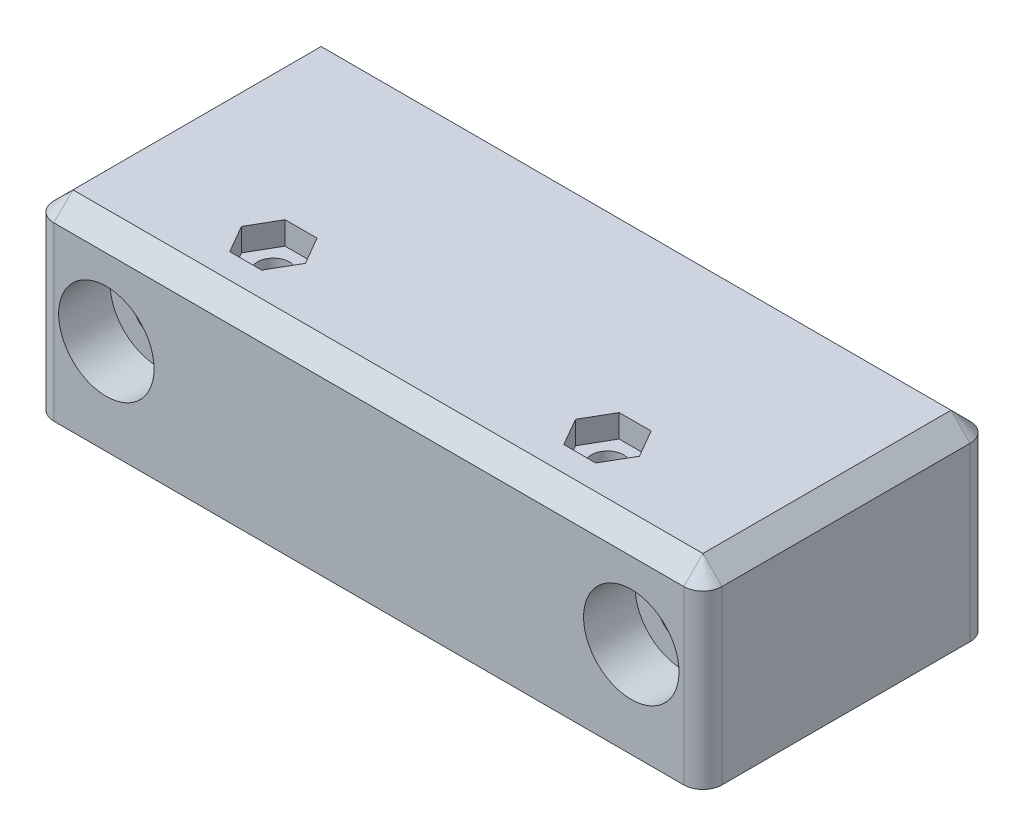
ISO-10303-21;
HEADER;
FILE_DESCRIPTION(('STEP AP214'),'2;1');
FILE_NAME('part.step','',(''),(''),'','','');
FILE_SCHEMA(('AUTOMOTIVE_DESIGN { 1 0 10303 214 1 1 1 1 }'));
ENDSEC;
DATA;
#1=APPLICATION_CONTEXT('core data for automotive mechanical design processes');
#2=APPLICATION_PROTOCOL_DEFINITION('international standard','automotive_design',2000,#1);
#3=PRODUCT_CONTEXT('',#1,'mechanical');
#4=PRODUCT('Part','Part','',(#3));
#5=PRODUCT_RELATED_PRODUCT_CATEGORY('part','',(#4));
#6=PRODUCT_DEFINITION_FORMATION('','',#4);
#7=PRODUCT_DEFINITION_CONTEXT('part definition',#1,'design');
#8=PRODUCT_DEFINITION('design','',#6,#7);
#9=PRODUCT_DEFINITION_SHAPE('','',#8);
#10=(LENGTH_UNIT() NAMED_UNIT(*) SI_UNIT(.MILLI.,.METRE.));
#11=(NAMED_UNIT(*) PLANE_ANGLE_UNIT() SI_UNIT($,.RADIAN.));
#12=(NAMED_UNIT(*) SI_UNIT($,.STERADIAN.) SOLID_ANGLE_UNIT());
#13=UNCERTAINTY_MEASURE_WITH_UNIT(LENGTH_MEASURE(1.E-05),#10,'distance_accuracy_value','');
#14=(GEOMETRIC_REPRESENTATION_CONTEXT(3) GLOBAL_UNCERTAINTY_ASSIGNED_CONTEXT((#13)) GLOBAL_UNIT_ASSIGNED_CONTEXT((#10,
#11,#12)) REPRESENTATION_CONTEXT('',''));
#15=CARTESIAN_POINT('',(0.,0.,0.));
#16=DIRECTION('',(0.,0.,1.));
#17=DIRECTION('',(1.,0.,0.));
#18=AXIS2_PLACEMENT_3D('',#15,#16,#17);
#19=CARTESIAN_POINT('',(-35.,96.1577310586391,30.));
#20=DIRECTION('',(1.,0.,0.));
#21=DIRECTION('',(0.,0.,-1.));
#22=AXIS2_PLACEMENT_3D('',#19,#20,#21);
#23=PLANE('',#22);
#24=DIRECTION('',(0.,-1.,0.));
#25=VECTOR('',#24,1.);
#26=CARTESIAN_POINT('',(-35.,96.1577310586391,28.));
#27=LINE('',#26,#25);
#28=CARTESIAN_POINT('',(-35.,0.,28.));
#29=VERTEX_POINT('',#28);
#30=CARTESIAN_POINT('',(-35.,18.,28.));
#31=VERTEX_POINT('',#30);
#32=EDGE_CURVE('E337',#29,#31,#27,.F.);
#33=ORIENTED_EDGE('',*,*,#32,.T.);
#34=DIRECTION('',(0.,0.,-1.));
#35=VECTOR('',#34,1.);
#36=CARTESIAN_POINT('',(-35.,18.,2.));
#37=LINE('',#36,#35);
#38=CARTESIAN_POINT('',(-35.,18.,2.));
#39=VERTEX_POINT('',#38);
#40=EDGE_CURVE('E351',#31,#39,#37,.T.);
#41=ORIENTED_EDGE('',*,*,#40,.T.);
#42=DIRECTION('',(0.,-1.,0.));
#43=VECTOR('',#42,1.);
#44=CARTESIAN_POINT('',(-35.,96.1577310586391,2.));
#45=LINE('',#44,#43);
#46=CARTESIAN_POINT('',(-35.,0.,2.));
#47=VERTEX_POINT('',#46);
#48=EDGE_CURVE('E340',#39,#47,#45,.T.);
#49=ORIENTED_EDGE('',*,*,#48,.T.);
#50=DIRECTION('',(0.,0.,1.));
#51=VECTOR('',#50,1.);
#52=CARTESIAN_POINT('',(-35.,0.,30.));
#53=LINE('',#52,#51);
#54=EDGE_CURVE('E246',#47,#29,#53,.T.);
#55=ORIENTED_EDGE('',*,*,#54,.T.);
#56=EDGE_LOOP('',(#33,#41,#49,#55));
#57=FACE_BOUND('',#56,.T.);
#58=ADVANCED_FACE('F40',(#57),#23,.F.);
#59=CARTESIAN_POINT('',(-35.,96.1577310586391,30.));
#60=DIRECTION('',(0.,0.,-1.));
#61=DIRECTION('',(-1.,0.,0.));
#62=AXIS2_PLACEMENT_3D('',#59,#60,#61);
#63=PLANE('',#62);
#64=CARTESIAN_POINT('',(-27.5,10.,30.));
#65=DIRECTION('',(0.,0.,1.));
#66=DIRECTION('',(1.,0.,0.));
#67=AXIS2_PLACEMENT_3D('',#64,#65,#66);
#68=CIRCLE('',#67,5.);
#69=CARTESIAN_POINT('',(-22.5,10.,30.));
#70=VERTEX_POINT('',#69);
#71=EDGE_CURVE('E387',#70,#70,#68,.T.);
#72=ORIENTED_EDGE('',*,*,#71,.F.);
#73=EDGE_LOOP('',(#72));
#74=FACE_BOUND('',#73,.T.);
#75=CARTESIAN_POINT('',(27.5,10.,30.));
#76=DIRECTION('',(0.,0.,1.));
#77=DIRECTION('',(1.,0.,0.));
#78=AXIS2_PLACEMENT_3D('',#75,#76,#77);
#79=CIRCLE('',#78,5.);
#80=CARTESIAN_POINT('',(32.5,10.,30.));
#81=VERTEX_POINT('',#80);
#82=EDGE_CURVE('E405',#81,#81,#79,.T.);
#83=ORIENTED_EDGE('',*,*,#82,.F.);
#84=EDGE_LOOP('',(#83));
#85=FACE_BOUND('',#84,.T.);
#86=DIRECTION('',(0.,-1.,0.));
#87=VECTOR('',#86,1.);
#88=CARTESIAN_POINT('',(33.,96.1577310586391,30.));
#89=LINE('',#88,#87);
#90=CARTESIAN_POINT('',(33.,0.,30.));
#91=VERTEX_POINT('',#90);
#92=CARTESIAN_POINT('',(33.,18.,30.));
#93=VERTEX_POINT('',#92);
#94=EDGE_CURVE('E329',#91,#93,#89,.F.);
#95=ORIENTED_EDGE('',*,*,#94,.T.);
#96=DIRECTION('',(-1.,0.,0.));
#97=VECTOR('',#96,1.);
#98=CARTESIAN_POINT('',(-33.,18.,30.));
#99=LINE('',#98,#97);
#100=CARTESIAN_POINT('',(-33.,18.,30.));
#101=VERTEX_POINT('',#100);
#102=EDGE_CURVE('E358',#93,#101,#99,.T.);
#103=ORIENTED_EDGE('',*,*,#102,.T.);
#104=DIRECTION('',(0.,-1.,0.));
#105=VECTOR('',#104,1.);
#106=CARTESIAN_POINT('',(-33.,96.1577310586391,30.));
#107=LINE('',#106,#105);
#108=CARTESIAN_POINT('',(-33.,0.,30.));
#109=VERTEX_POINT('',#108);
#110=EDGE_CURVE('E327',#101,#109,#107,.T.);
#111=ORIENTED_EDGE('',*,*,#110,.T.);
#112=DIRECTION('',(1.,0.,0.));
#113=VECTOR('',#112,1.);
#114=CARTESIAN_POINT('',(-35.,0.,30.));
#115=LINE('',#114,#113);
#116=EDGE_CURVE('E309',#109,#91,#115,.T.);
#117=ORIENTED_EDGE('',*,*,#116,.T.);
#118=EDGE_LOOP('',(#95,#103,#111,#117));
#119=FACE_BOUND('',#118,.T.);
#120=ADVANCED_FACE('F443',(#74,#85,#119),#63,.F.);
#121=CARTESIAN_POINT('',(35.,96.1577310586391,30.));
#122=DIRECTION('',(-1.,0.,0.));
#123=DIRECTION('',(0.,0.,1.));
#124=AXIS2_PLACEMENT_3D('',#121,#122,#123);
#125=PLANE('',#124);
#126=DIRECTION('',(0.,-1.,0.));
#127=VECTOR('',#126,1.);
#128=CARTESIAN_POINT('',(35.,96.1577310586391,2.));
#129=LINE('',#128,#127);
#130=CARTESIAN_POINT('',(35.,0.,2.));
#131=VERTEX_POINT('',#130);
#132=CARTESIAN_POINT('',(35.,18.,2.));
#133=VERTEX_POINT('',#132);
#134=EDGE_CURVE('E305',#131,#133,#129,.F.);
#135=ORIENTED_EDGE('',*,*,#134,.T.);
#136=DIRECTION('',(0.,0.,1.));
#137=VECTOR('',#136,1.);
#138=CARTESIAN_POINT('',(35.,18.,28.));
#139=LINE('',#138,#137);
#140=CARTESIAN_POINT('',(35.,18.,28.));
#141=VERTEX_POINT('',#140);
#142=EDGE_CURVE('E11',#133,#141,#139,.T.);
#143=ORIENTED_EDGE('',*,*,#142,.T.);
#144=DIRECTION('',(0.,-1.,0.));
#145=VECTOR('',#144,1.);
#146=CARTESIAN_POINT('',(35.,96.1577310586391,28.));
#147=LINE('',#146,#145);
#148=CARTESIAN_POINT('',(35.,0.,28.));
#149=VERTEX_POINT('',#148);
#150=EDGE_CURVE('E317',#141,#149,#147,.T.);
#151=ORIENTED_EDGE('',*,*,#150,.T.);
#152=DIRECTION('',(0.,0.,-1.));
#153=VECTOR('',#152,1.);
#154=CARTESIAN_POINT('',(35.,0.,30.));
#155=LINE('',#154,#153);
#156=EDGE_CURVE('E306',#149,#131,#155,.T.);
#157=ORIENTED_EDGE('',*,*,#156,.T.);
#158=EDGE_LOOP('',(#135,#143,#151,#157));
#159=FACE_BOUND('',#158,.T.);
#160=ADVANCED_FACE('F449',(#159),#125,.F.);
#161=CARTESIAN_POINT('',(-35.,96.1577310586391,0.));
#162=DIRECTION('',(0.,0.,1.));
#163=DIRECTION('',(1.,0.,0.));
#164=AXIS2_PLACEMENT_3D('',#161,#162,#163);
#165=PLANE('',#164);
#166=CARTESIAN_POINT('',(-27.5,10.,0.));
#167=DIRECTION('',(0.,0.,1.));
#168=DIRECTION('',(1.,0.,0.));
#169=AXIS2_PLACEMENT_3D('',#166,#167,#168);
#170=CIRCLE('',#169,2.74999999999999);
#171=CARTESIAN_POINT('',(-24.75,10.,0.));
#172=VERTEX_POINT('',#171);
#173=EDGE_CURVE('E402',#172,#172,#170,.T.);
#174=ORIENTED_EDGE('',*,*,#173,.T.);
#175=EDGE_LOOP('',(#174));
#176=FACE_BOUND('',#175,.T.);
#177=CARTESIAN_POINT('',(27.5,10.,0.));
#178=DIRECTION('',(0.,0.,1.));
#179=DIRECTION('',(1.,0.,0.));
#180=AXIS2_PLACEMENT_3D('',#177,#178,#179);
#181=CIRCLE('',#180,2.74999999999999);
#182=CARTESIAN_POINT('',(30.25,10.,0.));
#183=VERTEX_POINT('',#182);
#184=EDGE_CURVE('E414',#183,#183,#181,.T.);
#185=ORIENTED_EDGE('',*,*,#184,.T.);
#186=EDGE_LOOP('',(#185));
#187=FACE_BOUND('',#186,.T.);
#188=DIRECTION('',(0.,-1.,0.));
#189=VECTOR('',#188,1.);
#190=CARTESIAN_POINT('',(-33.,96.1577310586391,0.));
#191=LINE('',#190,#189);
#192=CARTESIAN_POINT('',(-33.,0.,0.));
#193=VERTEX_POINT('',#192);
#194=CARTESIAN_POINT('',(-33.,18.,0.));
#195=VERTEX_POINT('',#194);
#196=EDGE_CURVE('E332',#193,#195,#191,.F.);
#197=ORIENTED_EDGE('',*,*,#196,.T.);
#198=DIRECTION('',(1.,0.,0.));
#199=VECTOR('',#198,1.);
#200=CARTESIAN_POINT('',(33.,18.,0.));
#201=LINE('',#200,#199);
#202=CARTESIAN_POINT('',(33.,18.,0.));
#203=VERTEX_POINT('',#202);
#204=EDGE_CURVE('E360',#195,#203,#201,.T.);
#205=ORIENTED_EDGE('',*,*,#204,.T.);
#206=DIRECTION('',(0.,-1.,0.));
#207=VECTOR('',#206,1.);
#208=CARTESIAN_POINT('',(33.,96.1577310586391,0.));
#209=LINE('',#208,#207);
#210=CARTESIAN_POINT('',(33.,0.,0.));
#211=VERTEX_POINT('',#210);
#212=EDGE_CURVE('E335',#203,#211,#209,.T.);
#213=ORIENTED_EDGE('',*,*,#212,.T.);
#214=DIRECTION('',(-1.,0.,0.));
#215=VECTOR('',#214,1.);
#216=CARTESIAN_POINT('',(-35.,0.,0.));
#217=LINE('',#216,#215);
#218=EDGE_CURVE('E302',#211,#193,#217,.T.);
#219=ORIENTED_EDGE('',*,*,#218,.T.);
#220=EDGE_LOOP('',(#197,#205,#213,#219));
#221=FACE_BOUND('',#220,.T.);
#222=ADVANCED_FACE('F541',(#176,#187,#221),#165,.F.);
#223=CARTESIAN_POINT('',(0.,0.,0.));
#224=DIRECTION('',(0.,-1.,0.));
#225=DIRECTION('',(0.,0.,-1.));
#226=AXIS2_PLACEMENT_3D('',#223,#224,#225);
#227=PLANE('',#226);
#228=CARTESIAN_POINT('',(-17.5,0.,22.5));
#229=DIRECTION('',(0.,1.,0.));
#230=DIRECTION('',(0.,0.,1.));
#231=AXIS2_PLACEMENT_3D('',#228,#229,#230);
#232=CIRCLE('',#231,1.7);
#233=CARTESIAN_POINT('',(-17.5,0.,24.2));
#234=VERTEX_POINT('',#233);
#235=EDGE_CURVE('E417',#234,#234,#232,.T.);
#236=ORIENTED_EDGE('',*,*,#235,.T.);
#237=EDGE_LOOP('',(#236));
#238=FACE_BOUND('',#237,.T.);
#239=CARTESIAN_POINT('',(17.5,0.,22.5));
#240=DIRECTION('',(0.,1.,0.));
#241=DIRECTION('',(0.,0.,1.));
#242=AXIS2_PLACEMENT_3D('',#239,#240,#241);
#243=CIRCLE('',#242,1.7);
#244=CARTESIAN_POINT('',(17.5,0.,24.2));
#245=VERTEX_POINT('',#244);
#246=EDGE_CURVE('E222',#245,#245,#243,.T.);
#247=ORIENTED_EDGE('',*,*,#246,.T.);
#248=EDGE_LOOP('',(#247));
#249=FACE_BOUND('',#248,.T.);
#250=ORIENTED_EDGE('',*,*,#156,.F.);
#251=CARTESIAN_POINT('',(33.,0.,28.));
#252=DIRECTION('',(0.,-1.,0.));
#253=DIRECTION('',(0.,0.,-1.));
#254=AXIS2_PLACEMENT_3D('',#251,#252,#253);
#255=CIRCLE('',#254,2.);
#256=EDGE_CURVE('E325',#149,#91,#255,.T.);
#257=ORIENTED_EDGE('',*,*,#256,.T.);
#258=ORIENTED_EDGE('',*,*,#116,.F.);
#259=CARTESIAN_POINT('',(-33.,0.,28.));
#260=DIRECTION('',(0.,-1.,0.));
#261=DIRECTION('',(0.,0.,-1.));
#262=AXIS2_PLACEMENT_3D('',#259,#260,#261);
#263=CIRCLE('',#262,2.);
#264=EDGE_CURVE('E319',#109,#29,#263,.T.);
#265=ORIENTED_EDGE('',*,*,#264,.T.);
#266=ORIENTED_EDGE('',*,*,#54,.F.);
#267=CARTESIAN_POINT('',(-33.,0.,2.));
#268=DIRECTION('',(0.,-1.,0.));
#269=DIRECTION('',(0.,0.,-1.));
#270=AXIS2_PLACEMENT_3D('',#267,#268,#269);
#271=CIRCLE('',#270,2.);
#272=EDGE_CURVE('E321',#47,#193,#271,.T.);
#273=ORIENTED_EDGE('',*,*,#272,.T.);
#274=ORIENTED_EDGE('',*,*,#218,.F.);
#275=CARTESIAN_POINT('',(33.,0.,2.));
#276=DIRECTION('',(0.,-1.,0.));
#277=DIRECTION('',(0.,0.,-1.));
#278=AXIS2_PLACEMENT_3D('',#275,#276,#277);
#279=CIRCLE('',#278,2.);
#280=EDGE_CURVE('E323',#211,#131,#279,.T.);
#281=ORIENTED_EDGE('',*,*,#280,.T.);
#282=EDGE_LOOP('',(#250,#257,#258,#265,#266,#273,#274,#281));
#283=FACE_BOUND('',#282,.T.);
#284=ADVANCED_FACE('F426',(#238,#249,#283),#227,.T.);
#285=CARTESIAN_POINT('',(0.,20.,0.));
#286=DIRECTION('',(0.,1.,0.));
#287=DIRECTION('',(0.,0.,1.));
#288=AXIS2_PLACEMENT_3D('',#285,#286,#287);
#289=PLANE('',#288);
#290=DIRECTION('',(-1.,0.,0.));
#291=VECTOR('',#290,1.);
#292=CARTESIAN_POINT('',(-33.,20.,1.99999999999999));
#293=LINE('',#292,#291);
#294=CARTESIAN_POINT('',(33.,20.,2.));
#295=VERTEX_POINT('',#294);
#296=CARTESIAN_POINT('',(-33.,20.,1.99999999999999));
#297=VERTEX_POINT('',#296);
#298=EDGE_CURVE('E344',#295,#297,#293,.T.);
#299=ORIENTED_EDGE('',*,*,#298,.T.);
#300=DIRECTION('',(0.,0.,1.));
#301=VECTOR('',#300,1.);
#302=CARTESIAN_POINT('',(-33.,20.,28.));
#303=LINE('',#302,#301);
#304=CARTESIAN_POINT('',(-33.,20.,28.));
#305=VERTEX_POINT('',#304);
#306=EDGE_CURVE('E348',#297,#305,#303,.T.);
#307=ORIENTED_EDGE('',*,*,#306,.T.);
#308=DIRECTION('',(1.,0.,0.));
#309=VECTOR('',#308,1.);
#310=CARTESIAN_POINT('',(33.,20.,28.));
#311=LINE('',#310,#309);
#312=CARTESIAN_POINT('',(33.,20.,28.));
#313=VERTEX_POINT('',#312);
#314=EDGE_CURVE('E346',#305,#313,#311,.T.);
#315=ORIENTED_EDGE('',*,*,#314,.T.);
#316=DIRECTION('',(0.,0.,-1.));
#317=VECTOR('',#316,1.);
#318=CARTESIAN_POINT('',(33.,20.,2.));
#319=LINE('',#318,#317);
#320=EDGE_CURVE('E342',#313,#295,#319,.T.);
#321=ORIENTED_EDGE('',*,*,#320,.T.);
#322=EDGE_LOOP('',(#299,#307,#315,#321));
#323=FACE_BOUND('',#322,.T.);
#324=DIRECTION('',(-0.5,0.,-0.866025403784438));
#325=VECTOR('',#324,1.);
#326=CARTESIAN_POINT('',(-14.1513684387002,20.,22.5));
#327=LINE('',#326,#325);
#328=CARTESIAN_POINT('',(-14.1513684387002,20.,22.5));
#329=VERTEX_POINT('',#328);
#330=CARTESIAN_POINT('',(-15.8256842193501,20.,19.6));
#331=VERTEX_POINT('',#330);
#332=EDGE_CURVE('E198',#329,#331,#327,.T.);
#333=ORIENTED_EDGE('',*,*,#332,.F.);
#334=DIRECTION('',(0.5,0.,-0.866025403784438));
#335=VECTOR('',#334,1.);
#336=CARTESIAN_POINT('',(-15.8256842193501,20.,25.4));
#337=LINE('',#336,#335);
#338=CARTESIAN_POINT('',(-15.8256842193501,20.,25.4));
#339=VERTEX_POINT('',#338);
#340=EDGE_CURVE('E216',#339,#329,#337,.T.);
#341=ORIENTED_EDGE('',*,*,#340,.F.);
#342=DIRECTION('',(1.,0.,0.));
#343=VECTOR('',#342,1.);
#344=CARTESIAN_POINT('',(-19.1743157806499,20.,25.4));
#345=LINE('',#344,#343);
#346=CARTESIAN_POINT('',(-19.1743157806499,20.,25.4));
#347=VERTEX_POINT('',#346);
#348=EDGE_CURVE('E219',#347,#339,#345,.T.);
#349=ORIENTED_EDGE('',*,*,#348,.F.);
#350=DIRECTION('',(0.5,0.,0.866025403784438));
#351=VECTOR('',#350,1.);
#352=CARTESIAN_POINT('',(-20.8486315612998,20.,22.5));
#353=LINE('',#352,#351);
#354=CARTESIAN_POINT('',(-20.8486315612998,20.,22.5));
#355=VERTEX_POINT('',#354);
#356=EDGE_CURVE('E239',#355,#347,#353,.T.);
#357=ORIENTED_EDGE('',*,*,#356,.F.);
#358=DIRECTION('',(-0.499999999999999,0.,0.866025403784439));
#359=VECTOR('',#358,1.);
#360=CARTESIAN_POINT('',(-19.1743157806499,20.,19.6));
#361=LINE('',#360,#359);
#362=CARTESIAN_POINT('',(-19.1743157806499,20.,19.6));
#363=VERTEX_POINT('',#362);
#364=EDGE_CURVE('E236',#363,#355,#361,.T.);
#365=ORIENTED_EDGE('',*,*,#364,.F.);
#366=DIRECTION('',(-1.,0.,0.));
#367=VECTOR('',#366,1.);
#368=CARTESIAN_POINT('',(-15.8256842193501,20.,19.6));
#369=LINE('',#368,#367);
#370=EDGE_CURVE('E233',#331,#363,#369,.T.);
#371=ORIENTED_EDGE('',*,*,#370,.F.);
#372=EDGE_LOOP('',(#333,#341,#349,#357,#365,#371));
#373=FACE_BOUND('',#372,.T.);
#374=DIRECTION('',(-0.5,0.,-0.866025403784438));
#375=VECTOR('',#374,1.);
#376=CARTESIAN_POINT('',(20.8486315612998,20.,22.5));
#377=LINE('',#376,#375);
#378=CARTESIAN_POINT('',(20.8486315612998,20.,22.5));
#379=VERTEX_POINT('',#378);
#380=CARTESIAN_POINT('',(19.1743157806499,20.,19.6));
#381=VERTEX_POINT('',#380);
#382=EDGE_CURVE('E274',#379,#381,#377,.T.);
#383=ORIENTED_EDGE('',*,*,#382,.F.);
#384=DIRECTION('',(0.5,0.,-0.866025403784438));
#385=VECTOR('',#384,1.);
#386=CARTESIAN_POINT('',(19.1743157806499,20.,25.4));
#387=LINE('',#386,#385);
#388=CARTESIAN_POINT('',(19.1743157806499,20.,25.4));
#389=VERTEX_POINT('',#388);
#390=EDGE_CURVE('E258',#389,#379,#387,.T.);
#391=ORIENTED_EDGE('',*,*,#390,.F.);
#392=DIRECTION('',(1.,0.,0.));
#393=VECTOR('',#392,1.);
#394=CARTESIAN_POINT('',(15.8256842193501,20.,25.4));
#395=LINE('',#394,#393);
#396=CARTESIAN_POINT('',(15.8256842193501,20.,25.4));
#397=VERTEX_POINT('',#396);
#398=EDGE_CURVE('E286',#397,#389,#395,.T.);
#399=ORIENTED_EDGE('',*,*,#398,.F.);
#400=DIRECTION('',(0.5,0.,0.866025403784438));
#401=VECTOR('',#400,1.);
#402=CARTESIAN_POINT('',(14.1513684387002,20.,22.5));
#403=LINE('',#402,#401);
#404=CARTESIAN_POINT('',(14.1513684387002,20.,22.5));
#405=VERTEX_POINT('',#404);
#406=EDGE_CURVE('E283',#405,#397,#403,.T.);
#407=ORIENTED_EDGE('',*,*,#406,.F.);
#408=DIRECTION('',(-0.5,0.,0.866025403784439));
#409=VECTOR('',#408,1.);
#410=CARTESIAN_POINT('',(15.8256842193501,20.,19.6));
#411=LINE('',#410,#409);
#412=CARTESIAN_POINT('',(15.8256842193501,20.,19.6));
#413=VERTEX_POINT('',#412);
#414=EDGE_CURVE('E280',#413,#405,#411,.T.);
#415=ORIENTED_EDGE('',*,*,#414,.F.);
#416=DIRECTION('',(-1.,0.,0.));
#417=VECTOR('',#416,1.);
#418=CARTESIAN_POINT('',(19.1743157806499,20.,19.6));
#419=LINE('',#418,#417);
#420=EDGE_CURVE('E276',#381,#413,#419,.T.);
#421=ORIENTED_EDGE('',*,*,#420,.F.);
#422=EDGE_LOOP('',(#383,#391,#399,#407,#415,#421));
#423=FACE_BOUND('',#422,.T.);
#424=ADVANCED_FACE('F454',(#323,#373,#423),#289,.T.);
#425=CARTESIAN_POINT('',(20.8486315612998,17.6,22.5));
#426=DIRECTION('',(0.866025403784439,0.,-0.5));
#427=DIRECTION('',(-0.5,0.,-0.866025403784439));
#428=AXIS2_PLACEMENT_3D('',#425,#426,#427);
#429=PLANE('',#428);
#430=ORIENTED_EDGE('',*,*,#382,.T.);
#431=DIRECTION('',(0.,1.,0.));
#432=VECTOR('',#431,1.);
#433=CARTESIAN_POINT('',(19.1743157806499,17.6,19.6));
#434=LINE('',#433,#432);
#435=CARTESIAN_POINT('',(19.1743157806499,17.6,19.6));
#436=VERTEX_POINT('',#435);
#437=EDGE_CURVE('E273',#436,#381,#434,.T.);
#438=ORIENTED_EDGE('',*,*,#437,.F.);
#439=DIRECTION('',(-0.5,0.,-0.866025403784438));
#440=VECTOR('',#439,1.);
#441=CARTESIAN_POINT('',(20.8486315612998,17.6,22.5));
#442=LINE('',#441,#440);
#443=CARTESIAN_POINT('',(20.8486315612998,17.6,22.5));
#444=VERTEX_POINT('',#443);
#445=EDGE_CURVE('E254',#444,#436,#442,.T.);
#446=ORIENTED_EDGE('',*,*,#445,.F.);
#447=DIRECTION('',(0.,1.,0.));
#448=VECTOR('',#447,1.);
#449=CARTESIAN_POINT('',(20.8486315612998,17.6,22.5));
#450=LINE('',#449,#448);
#451=EDGE_CURVE('E234',#444,#379,#450,.T.);
#452=ORIENTED_EDGE('',*,*,#451,.T.);
#453=EDGE_LOOP('',(#430,#438,#446,#452));
#454=FACE_BOUND('',#453,.T.);
#455=ADVANCED_FACE('F457',(#454),#429,.F.);
#456=CARTESIAN_POINT('',(19.1743157806499,17.6,25.4));
#457=DIRECTION('',(0.866025403784439,0.,0.5));
#458=DIRECTION('',(0.5,0.,-0.866025403784439));
#459=AXIS2_PLACEMENT_3D('',#456,#457,#458);
#460=PLANE('',#459);
#461=ORIENTED_EDGE('',*,*,#390,.T.);
#462=ORIENTED_EDGE('',*,*,#451,.F.);
#463=DIRECTION('',(0.5,0.,-0.866025403784438));
#464=VECTOR('',#463,1.);
#465=CARTESIAN_POINT('',(19.1743157806499,17.6,25.4));
#466=LINE('',#465,#464);
#467=CARTESIAN_POINT('',(19.1743157806499,17.6,25.4));
#468=VERTEX_POINT('',#467);
#469=EDGE_CURVE('E270',#468,#444,#466,.T.);
#470=ORIENTED_EDGE('',*,*,#469,.F.);
#471=DIRECTION('',(0.,1.,0.));
#472=VECTOR('',#471,1.);
#473=CARTESIAN_POINT('',(19.1743157806499,17.6,25.4));
#474=LINE('',#473,#472);
#475=EDGE_CURVE('E292',#468,#389,#474,.T.);
#476=ORIENTED_EDGE('',*,*,#475,.T.);
#477=EDGE_LOOP('',(#461,#462,#470,#476));
#478=FACE_BOUND('',#477,.T.);
#479=ADVANCED_FACE('F574',(#478),#460,.F.);
#480=CARTESIAN_POINT('',(15.8256842193501,17.6,25.4));
#481=DIRECTION('',(0.,0.,1.));
#482=DIRECTION('',(1.,0.,0.));
#483=AXIS2_PLACEMENT_3D('',#480,#481,#482);
#484=PLANE('',#483);
#485=ORIENTED_EDGE('',*,*,#398,.T.);
#486=ORIENTED_EDGE('',*,*,#475,.F.);
#487=DIRECTION('',(1.,0.,0.));
#488=VECTOR('',#487,1.);
#489=CARTESIAN_POINT('',(15.8256842193501,17.6,25.4));
#490=LINE('',#489,#488);
#491=CARTESIAN_POINT('',(15.8256842193501,17.6,25.4));
#492=VERTEX_POINT('',#491);
#493=EDGE_CURVE('E267',#492,#468,#490,.T.);
#494=ORIENTED_EDGE('',*,*,#493,.F.);
#495=DIRECTION('',(0.,1.,0.));
#496=VECTOR('',#495,1.);
#497=CARTESIAN_POINT('',(15.8256842193501,17.6,25.4));
#498=LINE('',#497,#496);
#499=EDGE_CURVE('E294',#492,#397,#498,.T.);
#500=ORIENTED_EDGE('',*,*,#499,.T.);
#501=EDGE_LOOP('',(#485,#486,#494,#500));
#502=FACE_BOUND('',#501,.T.);
#503=ADVANCED_FACE('F576',(#502),#484,.F.);
#504=CARTESIAN_POINT('',(14.1513684387002,17.6,22.5));
#505=DIRECTION('',(-0.866025403784438,0.,0.5));
#506=DIRECTION('',(0.5,0.,0.866025403784439));
#507=AXIS2_PLACEMENT_3D('',#504,#505,#506);
#508=PLANE('',#507);
#509=ORIENTED_EDGE('',*,*,#406,.T.);
#510=ORIENTED_EDGE('',*,*,#499,.F.);
#511=DIRECTION('',(0.5,0.,0.866025403784438));
#512=VECTOR('',#511,1.);
#513=CARTESIAN_POINT('',(14.1513684387002,17.6,22.5));
#514=LINE('',#513,#512);
#515=CARTESIAN_POINT('',(14.1513684387002,17.6,22.5));
#516=VERTEX_POINT('',#515);
#517=EDGE_CURVE('E264',#516,#492,#514,.T.);
#518=ORIENTED_EDGE('',*,*,#517,.F.);
#519=DIRECTION('',(0.,1.,0.));
#520=VECTOR('',#519,1.);
#521=CARTESIAN_POINT('',(14.1513684387002,17.6,22.5));
#522=LINE('',#521,#520);
#523=EDGE_CURVE('E296',#516,#405,#522,.T.);
#524=ORIENTED_EDGE('',*,*,#523,.T.);
#525=EDGE_LOOP('',(#509,#510,#518,#524));
#526=FACE_BOUND('',#525,.T.);
#527=ADVANCED_FACE('F579',(#526),#508,.F.);
#528=CARTESIAN_POINT('',(15.8256842193501,17.6,19.6));
#529=DIRECTION('',(-0.866025403784439,0.,-0.5));
#530=DIRECTION('',(-0.5,0.,0.866025403784439));
#531=AXIS2_PLACEMENT_3D('',#528,#529,#530);
#532=PLANE('',#531);
#533=ORIENTED_EDGE('',*,*,#414,.T.);
#534=ORIENTED_EDGE('',*,*,#523,.F.);
#535=DIRECTION('',(-0.5,0.,0.866025403784439));
#536=VECTOR('',#535,1.);
#537=CARTESIAN_POINT('',(15.8256842193501,17.6,19.6));
#538=LINE('',#537,#536);
#539=CARTESIAN_POINT('',(15.8256842193501,17.6,19.6));
#540=VERTEX_POINT('',#539);
#541=EDGE_CURVE('E261',#540,#516,#538,.T.);
#542=ORIENTED_EDGE('',*,*,#541,.F.);
#543=DIRECTION('',(0.,1.,0.));
#544=VECTOR('',#543,1.);
#545=CARTESIAN_POINT('',(15.8256842193501,17.6,19.6));
#546=LINE('',#545,#544);
#547=EDGE_CURVE('E298',#540,#413,#546,.T.);
#548=ORIENTED_EDGE('',*,*,#547,.T.);
#549=EDGE_LOOP('',(#533,#534,#542,#548));
#550=FACE_BOUND('',#549,.T.);
#551=ADVANCED_FACE('F582',(#550),#532,.F.);
#552=CARTESIAN_POINT('',(19.1743157806499,17.6,19.6));
#553=DIRECTION('',(0.,0.,-1.));
#554=DIRECTION('',(-1.,0.,0.));
#555=AXIS2_PLACEMENT_3D('',#552,#553,#554);
#556=PLANE('',#555);
#557=ORIENTED_EDGE('',*,*,#420,.T.);
#558=ORIENTED_EDGE('',*,*,#547,.F.);
#559=DIRECTION('',(-1.,0.,0.));
#560=VECTOR('',#559,1.);
#561=CARTESIAN_POINT('',(19.1743157806499,17.6,19.6));
#562=LINE('',#561,#560);
#563=EDGE_CURVE('E257',#436,#540,#562,.T.);
#564=ORIENTED_EDGE('',*,*,#563,.F.);
#565=ORIENTED_EDGE('',*,*,#437,.T.);
#566=EDGE_LOOP('',(#557,#558,#564,#565));
#567=FACE_BOUND('',#566,.T.);
#568=ADVANCED_FACE('F567',(#567),#556,.F.);
#569=CARTESIAN_POINT('',(0.,17.6,0.));
#570=DIRECTION('',(0.,1.,0.));
#571=DIRECTION('',(0.,0.,1.));
#572=AXIS2_PLACEMENT_3D('',#569,#570,#571);
#573=PLANE('',#572);
#574=CARTESIAN_POINT('',(17.5,17.6,22.5));
#575=DIRECTION('',(0.,1.,0.));
#576=DIRECTION('',(0.,0.,1.));
#577=AXIS2_PLACEMENT_3D('',#574,#575,#576);
#578=CIRCLE('',#577,1.7);
#579=CARTESIAN_POINT('',(17.5,17.6,24.2));
#580=VERTEX_POINT('',#579);
#581=EDGE_CURVE('E277',#580,#580,#578,.T.);
#582=ORIENTED_EDGE('',*,*,#581,.F.);
#583=EDGE_LOOP('',(#582));
#584=FACE_BOUND('',#583,.T.);
#585=ORIENTED_EDGE('',*,*,#445,.T.);
#586=ORIENTED_EDGE('',*,*,#563,.T.);
#587=ORIENTED_EDGE('',*,*,#541,.T.);
#588=ORIENTED_EDGE('',*,*,#517,.T.);
#589=ORIENTED_EDGE('',*,*,#493,.T.);
#590=ORIENTED_EDGE('',*,*,#469,.T.);
#591=EDGE_LOOP('',(#585,#586,#587,#588,#589,#590));
#592=FACE_BOUND('',#591,.T.);
#593=ADVANCED_FACE('F570',(#584,#592),#573,.T.);
#594=CARTESIAN_POINT('',(-14.1513684387002,17.6,22.5));
#595=DIRECTION('',(0.866025403784439,0.,-0.5));
#596=DIRECTION('',(-0.5,0.,-0.866025403784439));
#597=AXIS2_PLACEMENT_3D('',#594,#595,#596);
#598=PLANE('',#597);
#599=ORIENTED_EDGE('',*,*,#332,.T.);
#600=DIRECTION('',(0.,1.,0.));
#601=VECTOR('',#600,1.);
#602=CARTESIAN_POINT('',(-15.8256842193501,17.6,19.6));
#603=LINE('',#602,#601);
#604=CARTESIAN_POINT('',(-15.8256842193501,17.6,19.6));
#605=VERTEX_POINT('',#604);
#606=EDGE_CURVE('E191',#605,#331,#603,.T.);
#607=ORIENTED_EDGE('',*,*,#606,.F.);
#608=DIRECTION('',(-0.5,0.,-0.866025403784438));
#609=VECTOR('',#608,1.);
#610=CARTESIAN_POINT('',(-14.1513684387002,17.6,22.5));
#611=LINE('',#610,#609);
#612=CARTESIAN_POINT('',(-14.1513684387002,17.6,22.5));
#613=VERTEX_POINT('',#612);
#614=EDGE_CURVE('E195',#613,#605,#611,.T.);
#615=ORIENTED_EDGE('',*,*,#614,.F.);
#616=DIRECTION('',(0.,1.,0.));
#617=VECTOR('',#616,1.);
#618=CARTESIAN_POINT('',(-14.1513684387002,17.6,22.5));
#619=LINE('',#618,#617);
#620=EDGE_CURVE('E244',#613,#329,#619,.T.);
#621=ORIENTED_EDGE('',*,*,#620,.T.);
#622=EDGE_LOOP('',(#599,#607,#615,#621));
#623=FACE_BOUND('',#622,.T.);
#624=ADVANCED_FACE('F193',(#623),#598,.F.);
#625=CARTESIAN_POINT('',(-15.8256842193501,17.6,25.4));
#626=DIRECTION('',(0.866025403784439,0.,0.5));
#627=DIRECTION('',(0.5,0.,-0.866025403784439));
#628=AXIS2_PLACEMENT_3D('',#625,#626,#627);
#629=PLANE('',#628);
#630=ORIENTED_EDGE('',*,*,#340,.T.);
#631=ORIENTED_EDGE('',*,*,#620,.F.);
#632=DIRECTION('',(0.5,0.,-0.866025403784438));
#633=VECTOR('',#632,1.);
#634=CARTESIAN_POINT('',(-15.8256842193501,17.6,25.4));
#635=LINE('',#634,#633);
#636=CARTESIAN_POINT('',(-15.8256842193501,17.6,25.4));
#637=VERTEX_POINT('',#636);
#638=EDGE_CURVE('E203',#637,#613,#635,.T.);
#639=ORIENTED_EDGE('',*,*,#638,.F.);
#640=DIRECTION('',(0.,1.,0.));
#641=VECTOR('',#640,1.);
#642=CARTESIAN_POINT('',(-15.8256842193501,17.6,25.4));
#643=LINE('',#642,#641);
#644=EDGE_CURVE('E247',#637,#339,#643,.T.);
#645=ORIENTED_EDGE('',*,*,#644,.T.);
#646=EDGE_LOOP('',(#630,#631,#639,#645));
#647=FACE_BOUND('',#646,.T.);
#648=ADVANCED_FACE('F659',(#647),#629,.F.);
#649=CARTESIAN_POINT('',(-19.1743157806499,17.6,25.4));
#650=DIRECTION('',(0.,0.,1.));
#651=DIRECTION('',(1.,0.,0.));
#652=AXIS2_PLACEMENT_3D('',#649,#650,#651);
#653=PLANE('',#652);
#654=ORIENTED_EDGE('',*,*,#348,.T.);
#655=ORIENTED_EDGE('',*,*,#644,.F.);
#656=DIRECTION('',(1.,0.,0.));
#657=VECTOR('',#656,1.);
#658=CARTESIAN_POINT('',(-19.1743157806499,17.6,25.4));
#659=LINE('',#658,#657);
#660=CARTESIAN_POINT('',(-19.1743157806499,17.6,25.4));
#661=VERTEX_POINT('',#660);
#662=EDGE_CURVE('E229',#661,#637,#659,.T.);
#663=ORIENTED_EDGE('',*,*,#662,.F.);
#664=DIRECTION('',(0.,1.,0.));
#665=VECTOR('',#664,1.);
#666=CARTESIAN_POINT('',(-19.1743157806499,17.6,25.4));
#667=LINE('',#666,#665);
#668=EDGE_CURVE('E249',#661,#347,#667,.T.);
#669=ORIENTED_EDGE('',*,*,#668,.T.);
#670=EDGE_LOOP('',(#654,#655,#663,#669));
#671=FACE_BOUND('',#670,.T.);
#672=ADVANCED_FACE('F668',(#671),#653,.F.);
#673=CARTESIAN_POINT('',(-20.8486315612998,17.6,22.5));
#674=DIRECTION('',(-0.866025403784439,0.,0.5));
#675=DIRECTION('',(0.5,0.,0.866025403784439));
#676=AXIS2_PLACEMENT_3D('',#673,#674,#675);
#677=PLANE('',#676);
#678=ORIENTED_EDGE('',*,*,#356,.T.);
#679=ORIENTED_EDGE('',*,*,#668,.F.);
#680=DIRECTION('',(0.5,0.,0.866025403784438));
#681=VECTOR('',#680,1.);
#682=CARTESIAN_POINT('',(-20.8486315612998,17.6,22.5));
#683=LINE('',#682,#681);
#684=CARTESIAN_POINT('',(-20.8486315612998,17.6,22.5));
#685=VERTEX_POINT('',#684);
#686=EDGE_CURVE('E226',#685,#661,#683,.T.);
#687=ORIENTED_EDGE('',*,*,#686,.F.);
#688=DIRECTION('',(0.,1.,0.));
#689=VECTOR('',#688,1.);
#690=CARTESIAN_POINT('',(-20.8486315612998,17.6,22.5));
#691=LINE('',#690,#689);
#692=EDGE_CURVE('E251',#685,#355,#691,.T.);
#693=ORIENTED_EDGE('',*,*,#692,.T.);
#694=EDGE_LOOP('',(#678,#679,#687,#693));
#695=FACE_BOUND('',#694,.T.);
#696=ADVANCED_FACE('F678',(#695),#677,.F.);
#697=CARTESIAN_POINT('',(-19.1743157806499,17.6,19.6));
#698=DIRECTION('',(-0.866025403784439,0.,-0.499999999999999));
#699=DIRECTION('',(-0.5,0.,0.866025403784439));
#700=AXIS2_PLACEMENT_3D('',#697,#698,#699);
#701=PLANE('',#700);
#702=ORIENTED_EDGE('',*,*,#364,.T.);
#703=ORIENTED_EDGE('',*,*,#692,.F.);
#704=DIRECTION('',(-0.499999999999999,0.,0.866025403784439));
#705=VECTOR('',#704,1.);
#706=CARTESIAN_POINT('',(-19.1743157806499,17.6,19.6));
#707=LINE('',#706,#705);
#708=CARTESIAN_POINT('',(-19.1743157806499,17.6,19.6));
#709=VERTEX_POINT('',#708);
#710=EDGE_CURVE('E211',#709,#685,#707,.T.);
#711=ORIENTED_EDGE('',*,*,#710,.F.);
#712=DIRECTION('',(0.,1.,0.));
#713=VECTOR('',#712,1.);
#714=CARTESIAN_POINT('',(-19.1743157806499,17.6,19.6));
#715=LINE('',#714,#713);
#716=EDGE_CURVE('E202',#709,#363,#715,.T.);
#717=ORIENTED_EDGE('',*,*,#716,.T.);
#718=EDGE_LOOP('',(#702,#703,#711,#717));
#719=FACE_BOUND('',#718,.T.);
#720=ADVANCED_FACE('F688',(#719),#701,.F.);
#721=CARTESIAN_POINT('',(-15.8256842193501,17.6,19.6));
#722=DIRECTION('',(0.,0.,-1.));
#723=DIRECTION('',(-1.,0.,0.));
#724=AXIS2_PLACEMENT_3D('',#721,#722,#723);
#725=PLANE('',#724);
#726=ORIENTED_EDGE('',*,*,#370,.T.);
#727=ORIENTED_EDGE('',*,*,#716,.F.);
#728=DIRECTION('',(-1.,0.,0.));
#729=VECTOR('',#728,1.);
#730=CARTESIAN_POINT('',(-15.8256842193501,17.6,19.6));
#731=LINE('',#730,#729);
#732=EDGE_CURVE('E206',#605,#709,#731,.T.);
#733=ORIENTED_EDGE('',*,*,#732,.F.);
#734=ORIENTED_EDGE('',*,*,#606,.T.);
#735=EDGE_LOOP('',(#726,#727,#733,#734));
#736=FACE_BOUND('',#735,.T.);
#737=ADVANCED_FACE('F207',(#736),#725,.F.);
#738=CARTESIAN_POINT('',(0.,17.6,0.));
#739=DIRECTION('',(0.,1.,0.));
#740=DIRECTION('',(0.,0.,1.));
#741=AXIS2_PLACEMENT_3D('',#738,#739,#740);
#742=PLANE('',#741);
#743=CARTESIAN_POINT('',(-17.5,17.6,22.5));
#744=DIRECTION('',(0.,1.,0.));
#745=DIRECTION('',(0.,0.,1.));
#746=AXIS2_PLACEMENT_3D('',#743,#744,#745);
#747=CIRCLE('',#746,1.7);
#748=CARTESIAN_POINT('',(-17.5,17.6,24.2));
#749=VERTEX_POINT('',#748);
#750=EDGE_CURVE('E419',#749,#749,#747,.T.);
#751=ORIENTED_EDGE('',*,*,#750,.F.);
#752=EDGE_LOOP('',(#751));
#753=FACE_BOUND('',#752,.T.);
#754=ORIENTED_EDGE('',*,*,#614,.T.);
#755=ORIENTED_EDGE('',*,*,#732,.T.);
#756=ORIENTED_EDGE('',*,*,#710,.T.);
#757=ORIENTED_EDGE('',*,*,#686,.T.);
#758=ORIENTED_EDGE('',*,*,#662,.T.);
#759=ORIENTED_EDGE('',*,*,#638,.T.);
#760=EDGE_LOOP('',(#754,#755,#756,#757,#758,#759));
#761=FACE_BOUND('',#760,.T.);
#762=ADVANCED_FACE('F213',(#753,#761),#742,.T.);
#763=CARTESIAN_POINT('',(17.5,20.,22.5));
#764=DIRECTION('',(0.,1.,0.));
#765=DIRECTION('',(0.,0.,1.));
#766=AXIS2_PLACEMENT_3D('',#763,#764,#765);
#767=CYLINDRICAL_SURFACE('',#766,1.7);
#768=ORIENTED_EDGE('',*,*,#581,.T.);
#769=EDGE_LOOP('',(#768));
#770=FACE_BOUND('',#769,.T.);
#771=ORIENTED_EDGE('',*,*,#246,.F.);
#772=EDGE_LOOP('',(#771));
#773=FACE_BOUND('',#772,.T.);
#774=ADVANCED_FACE('F429',(#770,#773),#767,.F.);
#775=CARTESIAN_POINT('',(-17.5,20.,22.5));
#776=DIRECTION('',(0.,1.,0.));
#777=DIRECTION('',(0.,0.,1.));
#778=AXIS2_PLACEMENT_3D('',#775,#776,#777);
#779=CYLINDRICAL_SURFACE('',#778,1.7);
#780=ORIENTED_EDGE('',*,*,#750,.T.);
#781=EDGE_LOOP('',(#780));
#782=FACE_BOUND('',#781,.T.);
#783=ORIENTED_EDGE('',*,*,#235,.F.);
#784=EDGE_LOOP('',(#783));
#785=FACE_BOUND('',#784,.T.);
#786=ADVANCED_FACE('F431',(#782,#785),#779,.F.);
#787=CARTESIAN_POINT('',(27.5,10.,30.));
#788=DIRECTION('',(0.,0.,1.));
#789=DIRECTION('',(1.,0.,0.));
#790=AXIS2_PLACEMENT_3D('',#787,#788,#789);
#791=CYLINDRICAL_SURFACE('',#790,2.75);
#792=ORIENTED_EDGE('',*,*,#184,.F.);
#793=EDGE_LOOP('',(#792));
#794=FACE_BOUND('',#793,.T.);
#795=CARTESIAN_POINT('',(27.5,10.,24.6));
#796=DIRECTION('',(0.,0.,1.));
#797=DIRECTION('',(1.,0.,0.));
#798=AXIS2_PLACEMENT_3D('',#795,#796,#797);
#799=CIRCLE('',#798,2.75);
#800=CARTESIAN_POINT('',(30.25,10.,24.6));
#801=VERTEX_POINT('',#800);
#802=EDGE_CURVE('E411',#801,#801,#799,.T.);
#803=ORIENTED_EDGE('',*,*,#802,.T.);
#804=EDGE_LOOP('',(#803));
#805=FACE_BOUND('',#804,.T.);
#806=ADVANCED_FACE('F438',(#794,#805),#791,.F.);
#807=CARTESIAN_POINT('',(30.25,10.,24.6));
#808=DIRECTION('',(0.,0.,-1.));
#809=DIRECTION('',(-1.,0.,0.));
#810=AXIS2_PLACEMENT_3D('',#807,#808,#809);
#811=PLANE('',#810);
#812=ORIENTED_EDGE('',*,*,#802,.F.);
#813=EDGE_LOOP('',(#812));
#814=FACE_BOUND('',#813,.T.);
#815=CARTESIAN_POINT('',(27.5,10.,24.6));
#816=DIRECTION('',(0.,0.,1.));
#817=DIRECTION('',(1.,0.,0.));
#818=AXIS2_PLACEMENT_3D('',#815,#816,#817);
#819=CIRCLE('',#818,5.);
#820=CARTESIAN_POINT('',(32.5,10.,24.6));
#821=VERTEX_POINT('',#820);
#822=EDGE_CURVE('E408',#821,#821,#819,.T.);
#823=ORIENTED_EDGE('',*,*,#822,.T.);
#824=EDGE_LOOP('',(#823));
#825=FACE_BOUND('',#824,.T.);
#826=ADVANCED_FACE('F738',(#814,#825),#811,.F.);
#827=CARTESIAN_POINT('',(27.5,10.,30.));
#828=DIRECTION('',(0.,0.,1.));
#829=DIRECTION('',(1.,0.,0.));
#830=AXIS2_PLACEMENT_3D('',#827,#828,#829);
#831=CYLINDRICAL_SURFACE('',#830,5.);
#832=ORIENTED_EDGE('',*,*,#822,.F.);
#833=EDGE_LOOP('',(#832));
#834=FACE_BOUND('',#833,.T.);
#835=ORIENTED_EDGE('',*,*,#82,.T.);
#836=EDGE_LOOP('',(#835));
#837=FACE_BOUND('',#836,.T.);
#838=ADVANCED_FACE('F748',(#834,#837),#831,.F.);
#839=CARTESIAN_POINT('',(-27.5,10.,30.));
#840=DIRECTION('',(0.,0.,1.));
#841=DIRECTION('',(1.,0.,0.));
#842=AXIS2_PLACEMENT_3D('',#839,#840,#841);
#843=CYLINDRICAL_SURFACE('',#842,2.75);
#844=ORIENTED_EDGE('',*,*,#173,.F.);
#845=EDGE_LOOP('',(#844));
#846=FACE_BOUND('',#845,.T.);
#847=CARTESIAN_POINT('',(-27.5,10.,24.6));
#848=DIRECTION('',(0.,0.,1.));
#849=DIRECTION('',(1.,0.,0.));
#850=AXIS2_PLACEMENT_3D('',#847,#848,#849);
#851=CIRCLE('',#850,2.75);
#852=CARTESIAN_POINT('',(-24.75,10.,24.6));
#853=VERTEX_POINT('',#852);
#854=EDGE_CURVE('E397',#853,#853,#851,.T.);
#855=ORIENTED_EDGE('',*,*,#854,.T.);
#856=EDGE_LOOP('',(#855));
#857=FACE_BOUND('',#856,.T.);
#858=ADVANCED_FACE('F758',(#846,#857),#843,.F.);
#859=CARTESIAN_POINT('',(-24.75,10.,24.6));
#860=DIRECTION('',(0.,0.,-1.));
#861=DIRECTION('',(-1.,0.,0.));
#862=AXIS2_PLACEMENT_3D('',#859,#860,#861);
#863=PLANE('',#862);
#864=ORIENTED_EDGE('',*,*,#854,.F.);
#865=EDGE_LOOP('',(#864));
#866=FACE_BOUND('',#865,.T.);
#867=CARTESIAN_POINT('',(-27.5,10.,24.6));
#868=DIRECTION('',(0.,0.,1.));
#869=DIRECTION('',(1.,0.,0.));
#870=AXIS2_PLACEMENT_3D('',#867,#868,#869);
#871=CIRCLE('',#870,5.);
#872=CARTESIAN_POINT('',(-22.5,10.,24.6));
#873=VERTEX_POINT('',#872);
#874=EDGE_CURVE('E392',#873,#873,#871,.T.);
#875=ORIENTED_EDGE('',*,*,#874,.T.);
#876=EDGE_LOOP('',(#875));
#877=FACE_BOUND('',#876,.T.);
#878=ADVANCED_FACE('F768',(#866,#877),#863,.F.);
#879=CARTESIAN_POINT('',(-27.5,10.,30.));
#880=DIRECTION('',(0.,0.,1.));
#881=DIRECTION('',(1.,0.,0.));
#882=AXIS2_PLACEMENT_3D('',#879,#880,#881);
#883=CYLINDRICAL_SURFACE('',#882,5.);
#884=ORIENTED_EDGE('',*,*,#874,.F.);
#885=EDGE_LOOP('',(#884));
#886=FACE_BOUND('',#885,.T.);
#887=ORIENTED_EDGE('',*,*,#71,.T.);
#888=EDGE_LOOP('',(#887));
#889=FACE_BOUND('',#888,.T.);
#890=ADVANCED_FACE('F463',(#886,#889),#883,.F.);
#891=CARTESIAN_POINT('',(33.,96.1577310586391,28.));
#892=DIRECTION('',(0.,-1.,0.));
#893=DIRECTION('',(0.,0.,-1.));
#894=AXIS2_PLACEMENT_3D('',#891,#892,#893);
#895=CYLINDRICAL_SURFACE('',#894,2.);
#896=ORIENTED_EDGE('',*,*,#150,.F.);
#897=CARTESIAN_POINT('',(33.,18.,28.));
#898=DIRECTION('',(0.,1.,0.));
#899=DIRECTION('',(0.,0.,1.));
#900=AXIS2_PLACEMENT_3D('',#897,#898,#899);
#901=CIRCLE('',#900,2.);
#902=EDGE_CURVE('E362',#141,#93,#901,.F.);
#903=ORIENTED_EDGE('',*,*,#902,.T.);
#904=ORIENTED_EDGE('',*,*,#94,.F.);
#905=ORIENTED_EDGE('',*,*,#256,.F.);
#906=EDGE_LOOP('',(#896,#903,#904,#905));
#907=FACE_BOUND('',#906,.T.);
#908=ADVANCED_FACE('F459',(#907),#895,.T.);
#909=CARTESIAN_POINT('',(33.,96.1577310586391,2.));
#910=DIRECTION('',(0.,-1.,0.));
#911=DIRECTION('',(0.,0.,-1.));
#912=AXIS2_PLACEMENT_3D('',#909,#910,#911);
#913=CYLINDRICAL_SURFACE('',#912,2.);
#914=ORIENTED_EDGE('',*,*,#212,.F.);
#915=CARTESIAN_POINT('',(33.,18.,2.));
#916=DIRECTION('',(0.,1.,0.));
#917=DIRECTION('',(0.,0.,1.));
#918=AXIS2_PLACEMENT_3D('',#915,#916,#917);
#919=CIRCLE('',#918,2.);
#920=EDGE_CURVE('E50',#203,#133,#919,.F.);
#921=ORIENTED_EDGE('',*,*,#920,.T.);
#922=ORIENTED_EDGE('',*,*,#134,.F.);
#923=ORIENTED_EDGE('',*,*,#280,.F.);
#924=EDGE_LOOP('',(#914,#921,#922,#923));
#925=FACE_BOUND('',#924,.T.);
#926=ADVANCED_FACE('F462',(#925),#913,.T.);
#927=CARTESIAN_POINT('',(-33.,96.1577310586391,2.));
#928=DIRECTION('',(0.,-1.,0.));
#929=DIRECTION('',(0.,0.,-1.));
#930=AXIS2_PLACEMENT_3D('',#927,#928,#929);
#931=CYLINDRICAL_SURFACE('',#930,2.);
#932=ORIENTED_EDGE('',*,*,#48,.F.);
#933=CARTESIAN_POINT('',(-33.,18.,2.));
#934=DIRECTION('',(0.,1.,0.));
#935=DIRECTION('',(0.,0.,1.));
#936=AXIS2_PLACEMENT_3D('',#933,#934,#935);
#937=CIRCLE('',#936,2.);
#938=EDGE_CURVE('E356',#39,#195,#937,.F.);
#939=ORIENTED_EDGE('',*,*,#938,.T.);
#940=ORIENTED_EDGE('',*,*,#196,.F.);
#941=ORIENTED_EDGE('',*,*,#272,.F.);
#942=EDGE_LOOP('',(#932,#939,#940,#941));
#943=FACE_BOUND('',#942,.T.);
#944=ADVANCED_FACE('F467',(#943),#931,.T.);
#945=CARTESIAN_POINT('',(-33.,96.1577310586391,28.));
#946=DIRECTION('',(0.,-1.,0.));
#947=DIRECTION('',(0.,0.,-1.));
#948=AXIS2_PLACEMENT_3D('',#945,#946,#947);
#949=CYLINDRICAL_SURFACE('',#948,2.);
#950=ORIENTED_EDGE('',*,*,#110,.F.);
#951=CARTESIAN_POINT('',(-33.,18.,28.));
#952=DIRECTION('',(0.,1.,0.));
#953=DIRECTION('',(0.,0.,1.));
#954=AXIS2_PLACEMENT_3D('',#951,#952,#953);
#955=CIRCLE('',#954,2.);
#956=EDGE_CURVE('E354',#101,#31,#955,.F.);
#957=ORIENTED_EDGE('',*,*,#956,.T.);
#958=ORIENTED_EDGE('',*,*,#32,.F.);
#959=ORIENTED_EDGE('',*,*,#264,.F.);
#960=EDGE_LOOP('',(#950,#957,#958,#959));
#961=FACE_BOUND('',#960,.T.);
#962=ADVANCED_FACE('F470',(#961),#949,.T.);
#963=CARTESIAN_POINT('',(33.,20.,0.));
#964=DIRECTION('',(0.70710678118655,0.707106781186544,0.));
#965=DIRECTION('',(0.,0.,1.));
#966=AXIS2_PLACEMENT_3D('',#963,#964,#965);
#967=PLANE('',#966);
#968=DIRECTION('',(-0.707106781186544,0.70710678118655,0.));
#969=VECTOR('',#968,1.);
#970=CARTESIAN_POINT('',(35.,18.,28.));
#971=LINE('',#970,#969);
#972=EDGE_CURVE('E380',#141,#313,#971,.T.);
#973=ORIENTED_EDGE('',*,*,#972,.F.);
#974=ORIENTED_EDGE('',*,*,#142,.F.);
#975=DIRECTION('',(0.707106781186544,-0.70710678118655,0.));
#976=VECTOR('',#975,1.);
#977=CARTESIAN_POINT('',(33.,20.,2.));
#978=LINE('',#977,#976);
#979=EDGE_CURVE('E45',#295,#133,#978,.T.);
#980=ORIENTED_EDGE('',*,*,#979,.F.);
#981=ORIENTED_EDGE('',*,*,#320,.F.);
#982=EDGE_LOOP('',(#973,#974,#980,#981));
#983=FACE_BOUND('',#982,.T.);
#984=ADVANCED_FACE('F43',(#983),#967,.T.);
#985=CARTESIAN_POINT('',(33.,18.,2.));
#986=DIRECTION('',(0.,-1.,0.));
#987=DIRECTION('',(0.,0.,-1.));
#988=AXIS2_PLACEMENT_3D('',#985,#986,#987);
#989=CONICAL_SURFACE('',#988,1.99999999999999,0.785398163397444);
#990=ORIENTED_EDGE('',*,*,#979,.T.);
#991=ORIENTED_EDGE('',*,*,#920,.F.);
#992=DIRECTION('',(0.,-0.70710678118655,-0.707106781186544));
#993=VECTOR('',#992,1.);
#994=CARTESIAN_POINT('',(33.,20.,1.99999999999999));
#995=LINE('',#994,#993);
#996=EDGE_CURVE('E378',#295,#203,#995,.T.);
#997=ORIENTED_EDGE('',*,*,#996,.F.);
#998=EDGE_LOOP('',(#990,#991,#997));
#999=FACE_BOUND('',#998,.T.);
#1000=ADVANCED_FACE('F516',(#999),#989,.T.);
#1001=CARTESIAN_POINT('',(33.,18.,28.));
#1002=DIRECTION('',(0.,-1.,0.));
#1003=DIRECTION('',(0.,0.,-1.));
#1004=AXIS2_PLACEMENT_3D('',#1001,#1002,#1003);
#1005=CONICAL_SURFACE('',#1004,1.99999999999999,0.785398163397444);
#1006=ORIENTED_EDGE('',*,*,#902,.F.);
#1007=ORIENTED_EDGE('',*,*,#972,.T.);
#1008=DIRECTION('',(0.,0.70710678118655,-0.707106781186544));
#1009=VECTOR('',#1008,1.);
#1010=CARTESIAN_POINT('',(33.,18.,30.));
#1011=LINE('',#1010,#1009);
#1012=EDGE_CURVE('E375',#93,#313,#1011,.T.);
#1013=ORIENTED_EDGE('',*,*,#1012,.F.);
#1014=EDGE_LOOP('',(#1006,#1007,#1013));
#1015=FACE_BOUND('',#1014,.T.);
#1016=ADVANCED_FACE('F510',(#1015),#1005,.T.);
#1017=CARTESIAN_POINT('',(0.,20.,1.99999999999999));
#1018=DIRECTION('',(0.,0.707106781186544,-0.70710678118655));
#1019=DIRECTION('',(1.,0.,0.));
#1020=AXIS2_PLACEMENT_3D('',#1017,#1018,#1019);
#1021=PLANE('',#1020);
#1022=ORIENTED_EDGE('',*,*,#996,.T.);
#1023=ORIENTED_EDGE('',*,*,#204,.F.);
#1024=DIRECTION('',(0.,-0.70710678118655,-0.707106781186544));
#1025=VECTOR('',#1024,1.);
#1026=CARTESIAN_POINT('',(-33.,20.,1.99999999999999));
#1027=LINE('',#1026,#1025);
#1028=EDGE_CURVE('E372',#297,#195,#1027,.T.);
#1029=ORIENTED_EDGE('',*,*,#1028,.F.);
#1030=ORIENTED_EDGE('',*,*,#298,.F.);
#1031=EDGE_LOOP('',(#1022,#1023,#1029,#1030));
#1032=FACE_BOUND('',#1031,.T.);
#1033=ADVANCED_FACE('F503',(#1032),#1021,.T.);
#1034=CARTESIAN_POINT('',(0.,20.,28.));
#1035=DIRECTION('',(0.,0.707106781186544,0.70710678118655));
#1036=DIRECTION('',(-1.,0.,0.));
#1037=AXIS2_PLACEMENT_3D('',#1034,#1035,#1036);
#1038=PLANE('',#1037);
#1039=ORIENTED_EDGE('',*,*,#1012,.T.);
#1040=ORIENTED_EDGE('',*,*,#314,.F.);
#1041=DIRECTION('',(0.,0.70710678118655,-0.707106781186544));
#1042=VECTOR('',#1041,1.);
#1043=CARTESIAN_POINT('',(-33.,18.,30.));
#1044=LINE('',#1043,#1042);
#1045=EDGE_CURVE('E369',#101,#305,#1044,.T.);
#1046=ORIENTED_EDGE('',*,*,#1045,.F.);
#1047=ORIENTED_EDGE('',*,*,#102,.F.);
#1048=EDGE_LOOP('',(#1039,#1040,#1046,#1047));
#1049=FACE_BOUND('',#1048,.T.);
#1050=ADVANCED_FACE('F496',(#1049),#1038,.T.);
#1051=CARTESIAN_POINT('',(-33.,18.,2.));
#1052=DIRECTION('',(0.,-1.,0.));
#1053=DIRECTION('',(0.,0.,-1.));
#1054=AXIS2_PLACEMENT_3D('',#1051,#1052,#1053);
#1055=CONICAL_SURFACE('',#1054,1.99999999999999,0.785398163397444);
#1056=ORIENTED_EDGE('',*,*,#1028,.T.);
#1057=ORIENTED_EDGE('',*,*,#938,.F.);
#1058=DIRECTION('',(-0.707106781186544,-0.70710678118655,0.));
#1059=VECTOR('',#1058,1.);
#1060=CARTESIAN_POINT('',(-33.,20.,2.));
#1061=LINE('',#1060,#1059);
#1062=EDGE_CURVE('E367',#297,#39,#1061,.T.);
#1063=ORIENTED_EDGE('',*,*,#1062,.F.);
#1064=EDGE_LOOP('',(#1056,#1057,#1063));
#1065=FACE_BOUND('',#1064,.T.);
#1066=ADVANCED_FACE('F489',(#1065),#1055,.T.);
#1067=CARTESIAN_POINT('',(-33.,18.,28.));
#1068=DIRECTION('',(0.,-1.,0.));
#1069=DIRECTION('',(0.,0.,-1.));
#1070=AXIS2_PLACEMENT_3D('',#1067,#1068,#1069);
#1071=CONICAL_SURFACE('',#1070,1.99999999999999,0.785398163397444);
#1072=ORIENTED_EDGE('',*,*,#956,.F.);
#1073=ORIENTED_EDGE('',*,*,#1045,.T.);
#1074=DIRECTION('',(0.707106781186544,0.70710678118655,0.));
#1075=VECTOR('',#1074,1.);
#1076=CARTESIAN_POINT('',(-35.,18.,28.));
#1077=LINE('',#1076,#1075);
#1078=EDGE_CURVE('E365',#31,#305,#1077,.T.);
#1079=ORIENTED_EDGE('',*,*,#1078,.F.);
#1080=EDGE_LOOP('',(#1072,#1073,#1079));
#1081=FACE_BOUND('',#1080,.T.);
#1082=ADVANCED_FACE('F482',(#1081),#1071,.T.);
#1083=CARTESIAN_POINT('',(-33.,20.,0.));
#1084=DIRECTION('',(-0.70710678118655,0.707106781186544,0.));
#1085=DIRECTION('',(0.,0.,-1.));
#1086=AXIS2_PLACEMENT_3D('',#1083,#1084,#1085);
#1087=PLANE('',#1086);
#1088=ORIENTED_EDGE('',*,*,#1062,.T.);
#1089=ORIENTED_EDGE('',*,*,#40,.F.);
#1090=ORIENTED_EDGE('',*,*,#1078,.T.);
#1091=ORIENTED_EDGE('',*,*,#306,.F.);
#1092=EDGE_LOOP('',(#1088,#1089,#1090,#1091));
#1093=FACE_BOUND('',#1092,.T.);
#1094=ADVANCED_FACE('F476',(#1093),#1087,.T.);
#1095=CLOSED_SHELL('',(#58,#120,#160,#222,#284,#424,#455,#479,#503,#527,#551,#568,#593,#624,
#648,#672,#696,#720,#737,#762,#774,#786,#806,#826,#838,#858,#878,#890,#908,#926,#944,#962,#984,
#1000,#1016,#1033,#1050,#1066,#1082,#1094));
#1096=MANIFOLD_SOLID_BREP('B2',#1095);
#1097=ADVANCED_BREP_SHAPE_REPRESENTATION('',(#18,#1096),#14);
#1098=SHAPE_DEFINITION_REPRESENTATION(#9,#1097);
ENDSEC;
END-ISO-10303-21;
